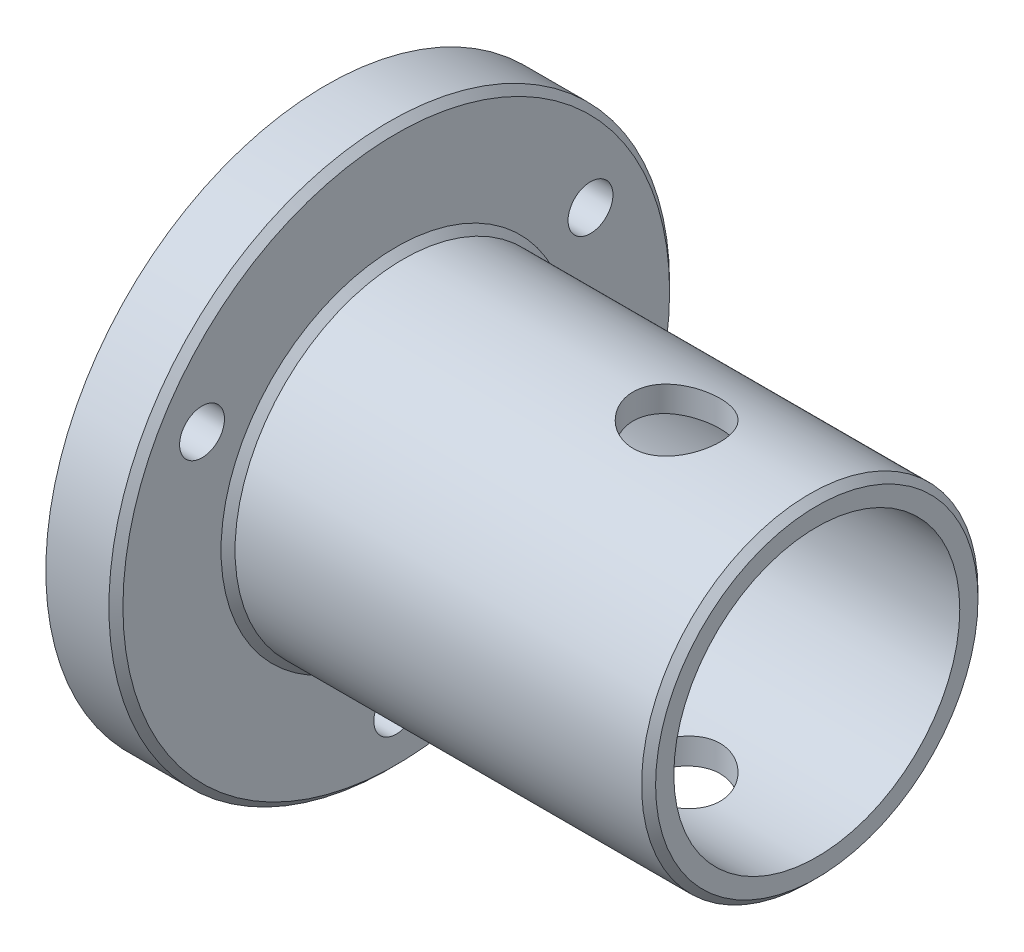
ISO-10303-21;
HEADER;
FILE_DESCRIPTION(('STEP AP214'),'2;1');
FILE_NAME('part.step','',(''),(''),'','','');
FILE_SCHEMA(('AUTOMOTIVE_DESIGN { 1 0 10303 214 1 1 1 1 }'));
ENDSEC;
DATA;
#1=APPLICATION_CONTEXT('core data for automotive mechanical design processes');
#2=APPLICATION_PROTOCOL_DEFINITION('international standard','automotive_design',2000,#1);
#3=PRODUCT_CONTEXT('',#1,'mechanical');
#4=PRODUCT('Part','Part','',(#3));
#5=PRODUCT_RELATED_PRODUCT_CATEGORY('part','',(#4));
#6=PRODUCT_DEFINITION_FORMATION('','',#4);
#7=PRODUCT_DEFINITION_CONTEXT('part definition',#1,'design');
#8=PRODUCT_DEFINITION('design','',#6,#7);
#9=PRODUCT_DEFINITION_SHAPE('','',#8);
#10=(LENGTH_UNIT() NAMED_UNIT(*) SI_UNIT(.MILLI.,.METRE.));
#11=(NAMED_UNIT(*) PLANE_ANGLE_UNIT() SI_UNIT($,.RADIAN.));
#12=(NAMED_UNIT(*) SI_UNIT($,.STERADIAN.) SOLID_ANGLE_UNIT());
#13=UNCERTAINTY_MEASURE_WITH_UNIT(LENGTH_MEASURE(1.E-05),#10,'distance_accuracy_value','');
#14=(GEOMETRIC_REPRESENTATION_CONTEXT(3) GLOBAL_UNCERTAINTY_ASSIGNED_CONTEXT((#13)) GLOBAL_UNIT_ASSIGNED_CONTEXT((#10,
#11,#12)) REPRESENTATION_CONTEXT('',''));
#15=CARTESIAN_POINT('',(0.,0.,0.));
#16=DIRECTION('',(0.,0.,1.));
#17=DIRECTION('',(1.,0.,0.));
#18=AXIS2_PLACEMENT_3D('',#15,#16,#17);
#19=CARTESIAN_POINT('',(35.,0.,0.));
#20=DIRECTION('',(-1.,0.,0.));
#21=DIRECTION('',(0.,0.,1.));
#22=AXIS2_PLACEMENT_3D('',#19,#20,#21);
#23=CYLINDRICAL_SURFACE('',#22,12.);
#24=CARTESIAN_POINT('',(5.50000000000001,0.,0.));
#25=DIRECTION('',(1.,0.,0.));
#26=DIRECTION('',(0.,0.,-1.));
#27=AXIS2_PLACEMENT_3D('',#24,#25,#26);
#28=CIRCLE('',#27,12.);
#29=CARTESIAN_POINT('',(5.50000000000001,0.,-12.));
#30=VERTEX_POINT('',#29);
#31=EDGE_CURVE('E48',#30,#30,#28,.T.);
#32=ORIENTED_EDGE('',*,*,#31,.T.);
#33=EDGE_LOOP('',(#32));
#34=FACE_BOUND('',#33,.T.);
#35=CARTESIAN_POINT('',(34.5,0.,0.));
#36=DIRECTION('',(1.,0.,0.));
#37=DIRECTION('',(0.,0.,-1.));
#38=AXIS2_PLACEMENT_3D('',#35,#36,#37);
#39=CIRCLE('',#38,12.);
#40=CARTESIAN_POINT('',(34.5,0.,-12.));
#41=VERTEX_POINT('',#40);
#42=EDGE_CURVE('E64',#41,#41,#39,.F.);
#43=ORIENTED_EDGE('',*,*,#42,.T.);
#44=EDGE_LOOP('',(#43));
#45=FACE_BOUND('',#44,.T.);
#46=CARTESIAN_POINT('',(25.,-11.5926700979541,-3.1));
#47=CARTESIAN_POINT('',(25.1709812687273,-11.5926732321222,-3.0999954912357));
#48=CARTESIAN_POINT('',(25.3420113313602,-11.5964941540659,-3.08580603872909));
#49=CARTESIAN_POINT('',(25.6791462756398,-11.611322692769,-3.02952201236185));
#50=CARTESIAN_POINT('',(25.8452484356607,-11.6223342063142,-2.9874123075328));
#51=CARTESIAN_POINT('',(26.1676021078596,-11.6502154462981,-2.8767528281645));
#52=CARTESIAN_POINT('',(26.323866564604,-11.6670772760698,-2.80823868019879));
#53=CARTESIAN_POINT('',(26.6227038965771,-11.7047492995837,-2.64682525331377));
#54=CARTESIAN_POINT('',(26.7652759501391,-11.7255597300546,-2.55392451222788));
#55=CARTESIAN_POINT('',(27.0360295916321,-11.7693315191616,-2.34404333029207));
#56=CARTESIAN_POINT('',(27.163842102149,-11.7923291195899,-2.22659423003465));
#57=CARTESIAN_POINT('',(27.3981915312794,-11.8375703908243,-1.97195898842077));
#58=CARTESIAN_POINT('',(27.5047263560674,-11.8598139872542,-1.83477090693754));
#59=CARTESIAN_POINT('',(27.695020595396,-11.9014436748245,-1.54200834198931));
#60=CARTESIAN_POINT('',(27.7784152918266,-11.9207820184585,-1.38618941543748));
#61=CARTESIAN_POINT('',(27.917687075037,-11.954007659976,-1.06216060658955));
#62=CARTESIAN_POINT('',(27.9735685063844,-11.9678958184176,-0.893952685441771));
#63=CARTESIAN_POINT('',(28.0550392473864,-11.9884000367007,-0.553770734206769));
#64=CARTESIAN_POINT('',(28.081255845454,-11.9951664669956,-0.381956155667461));
#65=CARTESIAN_POINT('',(28.1046239856346,-12.001189699885,-0.0362432207716312));
#66=CARTESIAN_POINT('',(28.1017801043448,-12.0004476849492,0.137654803164504));
#67=CARTESIAN_POINT('',(28.0675545353157,-11.9916487016588,0.478240037991099));
#68=CARTESIAN_POINT('',(28.0368502533953,-11.9837653766775,0.645000487656348));
#69=CARTESIAN_POINT('',(27.9488670322867,-11.9617730684823,0.970916767816803));
#70=CARTESIAN_POINT('',(27.8915866268404,-11.9476637417695,1.13007217819233));
#71=CARTESIAN_POINT('',(27.7515433557971,-11.9145431124111,1.43801789833881));
#72=CARTESIAN_POINT('',(27.6685438516611,-11.8954865666526,1.58669552694301));
#73=CARTESIAN_POINT('',(27.4795989672981,-11.8545318437837,1.86824666067749));
#74=CARTESIAN_POINT('',(27.3736493558522,-11.8326331429754,2.00111724451916));
#75=CARTESIAN_POINT('',(27.1381976920348,-11.7876283841855,2.25132438640943));
#76=CARTESIAN_POINT('',(27.0081042125355,-11.7645057211298,2.3681020323851));
#77=CARTESIAN_POINT('',(26.7299394465306,-11.7202333748904,2.57831380162861));
#78=CARTESIAN_POINT('',(26.5818671990644,-11.6990837972746,2.67174667630737));
#79=CARTESIAN_POINT('',(26.270795044652,-11.6610891819864,2.8330075364046));
#80=CARTESIAN_POINT('',(26.1077178096527,-11.6442683584863,2.90069245894728));
#81=CARTESIAN_POINT('',(25.7719576007214,-11.6171413090202,3.00750695874671));
#82=CARTESIAN_POINT('',(25.599276851601,-11.6068335809725,3.04664312037952));
#83=CARTESIAN_POINT('',(25.254416284425,-11.5942174237512,3.09430407740065));
#84=CARTESIAN_POINT('',(25.0823589764788,-11.5916921633405,3.10365887749602));
#85=CARTESIAN_POINT('',(24.7391401147316,-11.5943351499617,3.09377102744816));
#86=CARTESIAN_POINT('',(24.5679784738847,-11.5995026348923,3.07453121010369));
#87=CARTESIAN_POINT('',(24.2345484619628,-11.6167402601914,3.00873001478412));
#88=CARTESIAN_POINT('',(24.0721761697032,-11.6286862698099,2.96265957932974));
#89=CARTESIAN_POINT('',(23.7574610922742,-11.6580153953549,2.84505301580562));
#90=CARTESIAN_POINT('',(23.6051195589164,-11.6753991883511,2.77351371640119));
#91=CARTESIAN_POINT('',(23.3112953954056,-11.7140960291964,2.60528870310117));
#92=CARTESIAN_POINT('',(23.1701043789401,-11.735483254687,2.50811110154685));
#93=CARTESIAN_POINT('',(22.9057284588905,-11.7795988823168,2.2919839065464));
#94=CARTESIAN_POINT('',(22.782546730782,-11.8023275199903,2.1730304818004));
#95=CARTESIAN_POINT('',(22.5542829216208,-11.8473056159507,1.91290429530348));
#96=CARTESIAN_POINT('',(22.4497773110176,-11.86952570636,1.77121961861856));
#97=CARTESIAN_POINT('',(22.2660380700746,-11.9103524913061,1.47183340500616));
#98=CARTESIAN_POINT('',(22.1868031031189,-11.9289593769324,1.31413271578014));
#99=CARTESIAN_POINT('',(22.0565633389923,-11.9603442961819,0.988294681062561));
#100=CARTESIAN_POINT('',(22.0053511266874,-11.9731650294859,0.820244550200718));
#101=CARTESIAN_POINT('',(21.9319975894284,-11.991720545072,0.477545654715656));
#102=CARTESIAN_POINT('',(21.9098502465951,-11.9974567941815,0.302898263761298));
#103=CARTESIAN_POINT('',(21.895612710381,-12.0011325126361,-0.0426369024851989));
#104=CARTESIAN_POINT('',(21.9026743542239,-11.9992920014047,-0.213487900899179));
#105=CARTESIAN_POINT('',(21.9446985165505,-11.9885136629736,-0.551482300379906));
#106=CARTESIAN_POINT('',(21.9796601002656,-11.9795760735567,-0.718625825470205));
#107=CARTESIAN_POINT('',(22.0760243598104,-11.9556466521864,-1.04350746562916));
#108=CARTESIAN_POINT('',(22.1372644025869,-11.9406920931933,-1.20129674565794));
#109=CARTESIAN_POINT('',(22.284301037089,-11.9062979087882,-1.50445044483574));
#110=CARTESIAN_POINT('',(22.3701009020991,-11.8868576856027,-1.64981320444676));
#111=CARTESIAN_POINT('',(22.5663569175467,-11.8449659855827,-1.92797363703745));
#112=CARTESIAN_POINT('',(22.6773821284217,-11.8224507499527,-2.06036019542507));
#113=CARTESIAN_POINT('',(22.9198449996647,-11.7772189294356,-2.30491082042101));
#114=CARTESIAN_POINT('',(23.051287920397,-11.7545022940866,-2.41706965947591));
#115=CARTESIAN_POINT('',(23.3340626625102,-11.7109123351238,-2.62022343696176));
#116=CARTESIAN_POINT('',(23.485743729042,-11.6900857287345,-2.71074311737418));
#117=CARTESIAN_POINT('',(23.8026894353038,-11.653277237802,-2.86486495240525));
#118=CARTESIAN_POINT('',(23.9679445832601,-11.6372920039437,-2.92848572810478));
#119=CARTESIAN_POINT('',(24.2772970390116,-11.614338100382,-3.01809185517792));
#120=CARTESIAN_POINT('',(24.4199805799664,-11.6062759780297,-3.04873795147442));
#121=CARTESIAN_POINT('',(24.7084311240879,-11.5954409014947,-3.0896929427546));
#122=CARTESIAN_POINT('',(24.854197821516,-11.5926674253308,-3.10000384479342));
#123=CARTESIAN_POINT('',(25.,-11.5926700979541,-3.1));
#124=B_SPLINE_CURVE_WITH_KNOTS('',3,(#46,#47,#48,#49,#50,#51,#52,#53,#54,#55,#56,#57,#58,#59,
#60,#61,#62,#63,#64,#65,#66,#67,#68,#69,#70,#71,#72,#73,#74,#75,#76,#77,#78,#79,#80,#81,#82,#83,
#84,#85,#86,#87,#88,#89,#90,#91,#92,#93,#94,#95,#96,#97,#98,#99,#100,#101,#102,#103,#104,#105,
#106,#107,#108,#109,#110,#111,#112,#113,#114,#115,#116,#117,#118,#119,#120,#121,#122,#123),
.UNSPECIFIED.,.T.,.F.,(4,2,2,2,2,2,2,2,2,2,2,2,2,2,2,2,2,2,2,2,2,2,2,2,2,2,2,2,2,2,2,2,2,2,2,2,
2,2,4),(0.,0.512408032707482,1.02509398460181,1.53709059588618,2.0491179123776,2.57199825255387,
3.09493002132231,3.62568797741565,4.15636209562048,4.675591723518,5.19473958166113,
5.70159336892139,6.20847512364484,6.72016653527227,7.2319523658002,7.75850684065091,
8.28508947210651,8.81455663449601,9.34390164398051,9.85835850186142,10.3727643971578,
10.8780410008308,11.3833805426074,11.899226428746,12.4151631616504,12.9449880733492,
13.474784956878,14.000605506698,14.5263171682236,15.0368721362036,15.5474099991034,
16.0548327930151,16.5623232467484,17.0826576071283,17.6031262480937,18.1341484872393,
18.6648025157487,19.1017953096802,19.5387449708773),.UNSPECIFIED.);
#125=CARTESIAN_POINT('',(25.,-11.5926700979541,-3.1));
#126=VERTEX_POINT('',#125);
#127=EDGE_CURVE('E74',#126,#126,#124,.T.);
#128=ORIENTED_EDGE('',*,*,#127,.F.);
#129=EDGE_LOOP('',(#128));
#130=FACE_BOUND('',#129,.T.);
#131=CARTESIAN_POINT('',(25.,11.5926700979541,-3.1));
#132=CARTESIAN_POINT('',(24.8290187312727,11.5926732321222,-3.0999954912357));
#133=CARTESIAN_POINT('',(24.6579886686398,11.5964941540659,-3.08580603872909));
#134=CARTESIAN_POINT('',(24.3208537243602,11.611322692769,-3.02952201236185));
#135=CARTESIAN_POINT('',(24.1547515643393,11.6223342063142,-2.9874123075328));
#136=CARTESIAN_POINT('',(23.8323978921404,11.6502154462981,-2.8767528281645));
#137=CARTESIAN_POINT('',(23.676133435396,11.6670772760698,-2.80823868019879));
#138=CARTESIAN_POINT('',(23.3772961034229,11.7047492995837,-2.64682525331377));
#139=CARTESIAN_POINT('',(23.234724049861,11.7255597300546,-2.55392451222788));
#140=CARTESIAN_POINT('',(22.9639704083679,11.7693315191616,-2.34404333029207));
#141=CARTESIAN_POINT('',(22.836157897851,11.7923291195899,-2.22659423003465));
#142=CARTESIAN_POINT('',(22.6018084687206,11.8375703908244,-1.97195898842076));
#143=CARTESIAN_POINT('',(22.4952736439326,11.8598139872542,-1.83477090693754));
#144=CARTESIAN_POINT('',(22.304979404604,11.9014436748245,-1.54200834198931));
#145=CARTESIAN_POINT('',(22.2215847081734,11.9207820184585,-1.38618941543748));
#146=CARTESIAN_POINT('',(22.082312924963,11.954007659976,-1.06216060658955));
#147=CARTESIAN_POINT('',(22.0264314936156,11.9678958184176,-0.893952685441771));
#148=CARTESIAN_POINT('',(21.9449607526136,11.9884000367007,-0.553770734206769));
#149=CARTESIAN_POINT('',(21.918744154546,11.9951664669956,-0.381956155667461));
#150=CARTESIAN_POINT('',(21.8953760143654,12.001189699885,-0.0362432207716312));
#151=CARTESIAN_POINT('',(21.8982198956552,12.0004476849492,0.137654803164504));
#152=CARTESIAN_POINT('',(21.9324454646843,11.9916487016588,0.478240037991099));
#153=CARTESIAN_POINT('',(21.9631497466047,11.9837653766775,0.645000487656348));
#154=CARTESIAN_POINT('',(22.0511329677133,11.9617730684823,0.970916767816803));
#155=CARTESIAN_POINT('',(22.1084133731596,11.9476637417695,1.13007217819233));
#156=CARTESIAN_POINT('',(22.2484566442029,11.9145431124111,1.43801789833881));
#157=CARTESIAN_POINT('',(22.3314561483389,11.8954865666526,1.58669552694301));
#158=CARTESIAN_POINT('',(22.5204010327019,11.8545318437837,1.86824666067749));
#159=CARTESIAN_POINT('',(22.6263506441478,11.8326331429754,2.00111724451916));
#160=CARTESIAN_POINT('',(22.8618023079652,11.7876283841855,2.25132438640943));
#161=CARTESIAN_POINT('',(22.9918957874645,11.7645057211298,2.3681020323851));
#162=CARTESIAN_POINT('',(23.2700605534694,11.7202333748904,2.57831380162861));
#163=CARTESIAN_POINT('',(23.4181328009356,11.6990837972746,2.67174667630737));
#164=CARTESIAN_POINT('',(23.729204955348,11.6610891819864,2.8330075364046));
#165=CARTESIAN_POINT('',(23.8922821903473,11.6442683584863,2.90069245894728));
#166=CARTESIAN_POINT('',(24.2280423992787,11.6171413090202,3.00750695874672));
#167=CARTESIAN_POINT('',(24.400723148399,11.6068335809725,3.04664312037952));
#168=CARTESIAN_POINT('',(24.745583715575,11.5942174237512,3.09430407740065));
#169=CARTESIAN_POINT('',(24.9176410235212,11.5916921633405,3.10365887749602));
#170=CARTESIAN_POINT('',(25.2608598852684,11.5943351499617,3.09377102744816));
#171=CARTESIAN_POINT('',(25.4320215261153,11.5995026348923,3.07453121010369));
#172=CARTESIAN_POINT('',(25.7654515380372,11.6167402601914,3.00873001478412));
#173=CARTESIAN_POINT('',(25.9278238302968,11.6286862698099,2.96265957932974));
#174=CARTESIAN_POINT('',(26.2425389077258,11.6580153953549,2.84505301580562));
#175=CARTESIAN_POINT('',(26.3948804410836,11.6753991883511,2.77351371640119));
#176=CARTESIAN_POINT('',(26.6887046045944,11.7140960291964,2.60528870310117));
#177=CARTESIAN_POINT('',(26.8298956210599,11.735483254687,2.50811110154685));
#178=CARTESIAN_POINT('',(27.0942715411095,11.7795988823168,2.2919839065464));
#179=CARTESIAN_POINT('',(27.217453269218,11.8023275199903,2.1730304818004));
#180=CARTESIAN_POINT('',(27.4457170783792,11.8473056159507,1.91290429530348));
#181=CARTESIAN_POINT('',(27.5502226889824,11.86952570636,1.77121961861856));
#182=CARTESIAN_POINT('',(27.7339619299254,11.9103524913061,1.47183340500616));
#183=CARTESIAN_POINT('',(27.8131968968811,11.9289593769324,1.31413271578014));
#184=CARTESIAN_POINT('',(27.9434366610077,11.9603442961819,0.98829468106256));
#185=CARTESIAN_POINT('',(27.9946488733126,11.9731650294859,0.820244550200718));
#186=CARTESIAN_POINT('',(28.0680024105716,11.991720545072,0.477545654715656));
#187=CARTESIAN_POINT('',(28.0901497534049,11.9974567941815,0.302898263761298));
#188=CARTESIAN_POINT('',(28.104387289619,12.0011325126361,-0.0426369024851988));
#189=CARTESIAN_POINT('',(28.0973256457761,11.9992920014047,-0.213487900899178));
#190=CARTESIAN_POINT('',(28.0553014834495,11.9885136629736,-0.551482300379906));
#191=CARTESIAN_POINT('',(28.0203398997344,11.9795760735567,-0.718625825470205));
#192=CARTESIAN_POINT('',(27.9239756401896,11.9556466521864,-1.04350746562916));
#193=CARTESIAN_POINT('',(27.8627355974131,11.9406920931933,-1.20129674565794));
#194=CARTESIAN_POINT('',(27.715698962911,11.9062979087882,-1.50445044483574));
#195=CARTESIAN_POINT('',(27.6298990979009,11.8868576856027,-1.64981320444676));
#196=CARTESIAN_POINT('',(27.4336430824533,11.8449659855827,-1.92797363703745));
#197=CARTESIAN_POINT('',(27.3226178715783,11.8224507499527,-2.06036019542507));
#198=CARTESIAN_POINT('',(27.0801550003353,11.7772189294356,-2.30491082042101));
#199=CARTESIAN_POINT('',(26.948712079603,11.7545022940866,-2.41706965947591));
#200=CARTESIAN_POINT('',(26.6659373374898,11.7109123351238,-2.62022343696176));
#201=CARTESIAN_POINT('',(26.514256270958,11.6900857287345,-2.71074311737418));
#202=CARTESIAN_POINT('',(26.1973105646962,11.653277237802,-2.86486495240525));
#203=CARTESIAN_POINT('',(26.0320554167399,11.6372920039437,-2.92848572810478));
#204=CARTESIAN_POINT('',(25.7227029609884,11.614338100382,-3.01809185517792));
#205=CARTESIAN_POINT('',(25.5800194200336,11.6062759780297,-3.04873795147442));
#206=CARTESIAN_POINT('',(25.2915688759121,11.5954409014947,-3.0896929427546));
#207=CARTESIAN_POINT('',(25.145802178484,11.5926674253308,-3.10000384479342));
#208=CARTESIAN_POINT('',(25.,11.5926700979541,-3.1));
#209=B_SPLINE_CURVE_WITH_KNOTS('',3,(#131,#132,#133,#134,#135,#136,#137,#138,#139,#140,#141,
#142,#143,#144,#145,#146,#147,#148,#149,#150,#151,#152,#153,#154,#155,#156,#157,#158,#159,#160,
#161,#162,#163,#164,#165,#166,#167,#168,#169,#170,#171,#172,#173,#174,#175,#176,#177,#178,#179,
#180,#181,#182,#183,#184,#185,#186,#187,#188,#189,#190,#191,#192,#193,#194,#195,#196,#197,#198,
#199,#200,#201,#202,#203,#204,#205,#206,#207,#208),.UNSPECIFIED.,.T.,.F.,(4,2,2,2,2,2,2,2,2,2,2,
2,2,2,2,2,2,2,2,2,2,2,2,2,2,2,2,2,2,2,2,2,2,2,2,2,2,2,4),(0.,0.512408032707482,1.02509398460181,
1.53709059588618,2.0491179123776,2.57199825255387,3.09493002132231,3.62568797741565,
4.15636209562048,4.675591723518,5.19473958166113,5.70159336892139,6.20847512364484,
6.72016653527227,7.2319523658002,7.75850684065091,8.28508947210651,8.81455663449601,
9.34390164398051,9.85835850186142,10.3727643971578,10.8780410008308,11.3833805426074,
11.899226428746,12.4151631616504,12.9449880733492,13.474784956878,14.000605506698,
14.5263171682236,15.0368721362036,15.5474099991034,16.0548327930151,16.5623232467484,
17.0826576071283,17.6031262480937,18.1341484872393,18.6648025157487,19.1017953096802,
19.5387449708773),.UNSPECIFIED.);
#210=CARTESIAN_POINT('',(25.,11.5926700979541,-3.1));
#211=VERTEX_POINT('',#210);
#212=EDGE_CURVE('E106',#211,#211,#209,.T.);
#213=ORIENTED_EDGE('',*,*,#212,.F.);
#214=EDGE_LOOP('',(#213));
#215=FACE_BOUND('',#214,.T.);
#216=ADVANCED_FACE('F39',(#34,#45,#130,#215),#23,.T.);
#217=CARTESIAN_POINT('',(5.,0.,0.));
#218=DIRECTION('',(1.,0.,0.));
#219=DIRECTION('',(0.,0.,-1.));
#220=AXIS2_PLACEMENT_3D('',#217,#218,#219);
#221=CYLINDRICAL_SURFACE('',#220,10.2);
#222=CARTESIAN_POINT('',(5.,0.,0.));
#223=DIRECTION('',(1.,0.,0.));
#224=DIRECTION('',(0.,0.,-1.));
#225=AXIS2_PLACEMENT_3D('',#222,#223,#224);
#226=CIRCLE('',#225,10.2);
#227=CARTESIAN_POINT('',(5.,0.,-10.2));
#228=VERTEX_POINT('',#227);
#229=EDGE_CURVE('E156',#228,#228,#226,.T.);
#230=ORIENTED_EDGE('',*,*,#229,.F.);
#231=EDGE_LOOP('',(#230));
#232=FACE_BOUND('',#231,.T.);
#233=CARTESIAN_POINT('',(35.,0.,0.));
#234=DIRECTION('',(1.,0.,0.));
#235=DIRECTION('',(0.,0.,-1.));
#236=AXIS2_PLACEMENT_3D('',#233,#234,#235);
#237=CIRCLE('',#236,10.2);
#238=CARTESIAN_POINT('',(35.,0.,-10.2));
#239=VERTEX_POINT('',#238);
#240=EDGE_CURVE('E163',#239,#239,#237,.T.);
#241=ORIENTED_EDGE('',*,*,#240,.T.);
#242=EDGE_LOOP('',(#241));
#243=FACE_BOUND('',#242,.T.);
#244=CARTESIAN_POINT('',(25.,-9.71750996912275,-3.1));
#245=CARTESIAN_POINT('',(24.8302450215042,-9.71751152044069,-3.09999817405107));
#246=CARTESIAN_POINT('',(24.6604719771617,-9.72200681201951,-3.08600901394495));
#247=CARTESIAN_POINT('',(24.3258968655872,-9.73942808103335,-3.03057106714479));
#248=CARTESIAN_POINT('',(24.161096376696,-9.75235670644731,-2.98911365564171));
#249=CARTESIAN_POINT('',(23.8413591630495,-9.78504803212674,-2.88028292198343));
#250=CARTESIAN_POINT('',(23.6864062263503,-9.80479913636959,-2.81295355215432));
#251=CARTESIAN_POINT('',(23.389955714033,-9.84889414240463,-2.65443526710116));
#252=CARTESIAN_POINT('',(23.2484602716798,-9.87323877053737,-2.56324257766043));
#253=CARTESIAN_POINT('',(22.978344989818,-9.92466471031361,-2.35641449228445));
#254=CARTESIAN_POINT('',(22.8502268031283,-9.95180548758248,-2.24013857784791));
#255=CARTESIAN_POINT('',(22.6149750509031,-10.005258279883,-1.98781669350988));
#256=CARTESIAN_POINT('',(22.507844253431,-10.0315701852097,-1.85176811987424));
#257=CARTESIAN_POINT('',(22.3154190333366,-10.0810775315666,-1.56018293657677));
#258=CARTESIAN_POINT('',(22.2306376916155,-10.1041947568644,-1.40429328666226));
#259=CARTESIAN_POINT('',(22.0886896508701,-10.1440160742436,-1.07964676222009));
#260=CARTESIAN_POINT('',(22.0315168312215,-10.1607215875898,-0.910892749249633));
#261=CARTESIAN_POINT('',(21.9480734911396,-10.1854164163053,-0.570557381789036));
#262=CARTESIAN_POINT('',(21.9209463428416,-10.1936468513655,-0.39920386796128));
#263=CARTESIAN_POINT('',(21.8956540161598,-10.2013140734623,-0.05419318290849));
#264=CARTESIAN_POINT('',(21.8974825998725,-10.2007527544977,0.119463484096522));
#265=CARTESIAN_POINT('',(21.9294783884922,-10.1910693627075,0.458135320732019));
#266=CARTESIAN_POINT('',(21.9587176388452,-10.1822276232319,0.623247442175158));
#267=CARTESIAN_POINT('',(22.0431868451824,-10.1573188275363,0.946099613824698));
#268=CARTESIAN_POINT('',(22.0984184632633,-10.1412513092627,1.10383919188041));
#269=CARTESIAN_POINT('',(22.2339229180099,-10.1033122578068,1.40965435486965));
#270=CARTESIAN_POINT('',(22.3144844142241,-10.0813742771303,1.55759345374656));
#271=CARTESIAN_POINT('',(22.4981324522778,-10.0340164420241,1.83814744235965));
#272=CARTESIAN_POINT('',(22.6012244491734,-10.0085957449207,1.9707586090077));
#273=CARTESIAN_POINT('',(22.8318048177572,-9.95580268410267,2.22242892081083));
#274=CARTESIAN_POINT('',(22.9600963080449,-9.92839289329177,2.34074539451154));
#275=CARTESIAN_POINT('',(23.23496359088,-9.87558572669925,2.55439820171712));
#276=CARTESIAN_POINT('',(23.3815412989424,-9.85018856220037,2.64973212468498));
#277=CARTESIAN_POINT('',(23.690819755918,-9.8041002409542,2.81551563282123));
#278=CARTESIAN_POINT('',(23.8536679883314,-9.78345904441839,2.8857049894421));
#279=CARTESIAN_POINT('',(24.1896478503937,-9.74981034050356,2.99743933215379));
#280=CARTESIAN_POINT('',(24.3627759996615,-9.73680026556839,3.03899395346983));
#281=CARTESIAN_POINT('',(24.7073183007616,-9.7204523589455,3.0908772547888));
#282=CARTESIAN_POINT('',(24.8785455671834,-9.71676424006692,3.10233745629306));
#283=CARTESIAN_POINT('',(25.2204835509012,-9.71850799272476,3.09687162522216));
#284=CARTESIAN_POINT('',(25.3911943392275,-9.72393854720213,3.07994969203184));
#285=CARTESIAN_POINT('',(25.7224871317896,-9.74296332767579,3.01920875619412));
#286=CARTESIAN_POINT('',(25.8832180488902,-9.75633422980108,2.9761248439431));
#287=CARTESIAN_POINT('',(26.1951566175759,-9.78950014170735,2.86513861093793));
#288=CARTESIAN_POINT('',(26.3463627682508,-9.80929616094788,2.79723239010284));
#289=CARTESIAN_POINT('',(26.639545020713,-9.85375620540459,2.63640131889928));
#290=CARTESIAN_POINT('',(26.7811544061834,-9.87853881529002,2.54284158263211));
#291=CARTESIAN_POINT('',(27.0470762888478,-9.92992781491066,2.33410928364215));
#292=CARTESIAN_POINT('',(27.1713845230862,-9.95653465172834,2.21893141063123));
#293=CARTESIAN_POINT('',(27.4041569772682,-10.0098260484167,1.96490204351708));
#294=CARTESIAN_POINT('',(27.5118173002569,-10.0364734121133,1.82530424513182));
#295=CARTESIAN_POINT('',(27.7022076049596,-10.0858041855733,1.52938564942507));
#296=CARTESIAN_POINT('',(27.7849387988074,-10.108487788045,1.37306566569059));
#297=CARTESIAN_POINT('',(27.9223244655421,-10.147199166401,1.04915396951939));
#298=CARTESIAN_POINT('',(27.9771870565103,-10.1632761018927,0.881656703786007));
#299=CARTESIAN_POINT('',(28.05779818094,-10.1871795891735,0.539242024508868));
#300=CARTESIAN_POINT('',(28.083555284632,-10.195008569561,0.364326810958115));
#301=CARTESIAN_POINT('',(28.1045586590578,-10.2013821230789,0.0194614478171838));
#302=CARTESIAN_POINT('',(28.1009692789239,-10.2002810199824,-0.150412109609827));
#303=CARTESIAN_POINT('',(28.0661750168558,-10.1897574489741,-0.487029052736546));
#304=CARTESIAN_POINT('',(28.0349717720991,-10.1803354743921,-0.653772623409167));
#305=CARTESIAN_POINT('',(27.9465627581109,-10.1543333132044,-0.977560580536301));
#306=CARTESIAN_POINT('',(27.8896540826081,-10.1378350190092,-1.13469311646604));
#307=CARTESIAN_POINT('',(27.7517161025282,-10.0993845917701,-1.43725992323385));
#308=CARTESIAN_POINT('',(27.670682776863,-10.0774315496317,-1.58269223874625));
#309=CARTESIAN_POINT('',(27.4837345655533,-10.0294829537495,-1.86288624651997));
#310=CARTESIAN_POINT('',(27.3770945300677,-10.0033789276274,-1.99714538316468));
#311=CARTESIAN_POINT('',(27.1432575142778,-9.95040724486369,-2.24625153460547));
#312=CARTESIAN_POINT('',(27.0160545426973,-9.92353936755032,-2.36109287176285));
#313=CARTESIAN_POINT('',(26.7399985787473,-9.87110435373929,-2.57166419856939));
#314=CARTESIAN_POINT('',(26.5905990918477,-9.84560284157931,-2.6666959638801));
#315=CARTESIAN_POINT('',(26.2771983529708,-9.79986132175625,-2.83018841200397));
#316=CARTESIAN_POINT('',(26.1132038217015,-9.77961890904759,-2.89866124760287));
#317=CARTESIAN_POINT('',(25.7923076301982,-9.74858345429049,-3.00128316633864));
#318=CARTESIAN_POINT('',(25.6363592817447,-9.73704318175158,-3.03819792227743));
#319=CARTESIAN_POINT('',(25.3202787134467,-9.72150651435692,-3.08755458260381));
#320=CARTESIAN_POINT('',(25.1601473961124,-9.71750850560438,-3.10000172260613));
#321=CARTESIAN_POINT('',(25.,-9.71750996912275,-3.1));
#322=B_SPLINE_CURVE_WITH_KNOTS('',3,(#244,#245,#246,#247,#248,#249,#250,#251,#252,#253,#254,
#255,#256,#257,#258,#259,#260,#261,#262,#263,#264,#265,#266,#267,#268,#269,#270,#271,#272,#273,
#274,#275,#276,#277,#278,#279,#280,#281,#282,#283,#284,#285,#286,#287,#288,#289,#290,#291,#292,
#293,#294,#295,#296,#297,#298,#299,#300,#301,#302,#303,#304,#305,#306,#307,#308,#309,#310,#311,
#312,#313,#314,#315,#316,#317,#318,#319,#320,#321),.UNSPECIFIED.,.T.,.F.,(4,2,2,2,2,2,2,2,2,2,2,
2,2,2,2,2,2,2,2,2,2,2,2,2,2,2,2,2,2,2,2,2,2,2,2,2,2,2,4),(0.,0.508673923489766,1.01750764222181,
1.52548072835019,2.03353420398484,2.55654379281369,3.0796223159146,3.61382976824119,
4.14791873592496,4.66635360874123,5.18467679718739,5.68606308682018,6.18748144224144,
6.69483477824863,7.20231109035253,7.72984243161905,8.25742907924015,8.79032805081103,
9.32304762096161,9.83543005156785,10.3477384823882,10.846278448659,11.3448967792182,
11.8571856041719,12.3696004330476,12.9019373597178,13.4342483982882,13.9625235274308,
14.49064306322,14.9979137697689,15.5051544031428,16.0066768759045,16.5082829890964,
17.0262447880098,17.5443577746761,18.0784415355625,18.6122806222767,19.0922679675325,
19.5721525932384),.UNSPECIFIED.);
#323=CARTESIAN_POINT('',(25.,-9.71750996912275,-3.1));
#324=VERTEX_POINT('',#323);
#325=EDGE_CURVE('E75',#324,#324,#322,.T.);
#326=ORIENTED_EDGE('',*,*,#325,.F.);
#327=EDGE_LOOP('',(#326));
#328=FACE_BOUND('',#327,.T.);
#329=CARTESIAN_POINT('',(25.,9.71750996912275,-3.1));
#330=CARTESIAN_POINT('',(25.1697549784958,9.71751152044069,-3.09999817405107));
#331=CARTESIAN_POINT('',(25.3395280228383,9.72200681201951,-3.08600901394495));
#332=CARTESIAN_POINT('',(25.6741031344128,9.73942808103335,-3.03057106714479));
#333=CARTESIAN_POINT('',(25.838903623304,9.75235670644731,-2.98911365564171));
#334=CARTESIAN_POINT('',(26.1586408369505,9.78504803212674,-2.88028292198343));
#335=CARTESIAN_POINT('',(26.3135937736497,9.80479913636959,-2.81295355215432));
#336=CARTESIAN_POINT('',(26.610044285967,9.84889414240463,-2.65443526710116));
#337=CARTESIAN_POINT('',(26.7515397283202,9.87323877053737,-2.56324257766043));
#338=CARTESIAN_POINT('',(27.021655010182,9.92466471031361,-2.35641449228445));
#339=CARTESIAN_POINT('',(27.1497731968717,9.95180548758248,-2.24013857784791));
#340=CARTESIAN_POINT('',(27.3850249490969,10.005258279883,-1.98781669350988));
#341=CARTESIAN_POINT('',(27.492155746569,10.0315701852097,-1.85176811987424));
#342=CARTESIAN_POINT('',(27.6845809666634,10.0810775315666,-1.56018293657677));
#343=CARTESIAN_POINT('',(27.7693623083845,10.1041947568644,-1.40429328666226));
#344=CARTESIAN_POINT('',(27.9113103491299,10.1440160742436,-1.07964676222009));
#345=CARTESIAN_POINT('',(27.9684831687785,10.1607215875898,-0.910892749249632));
#346=CARTESIAN_POINT('',(28.0519265088604,10.1854164163053,-0.570557381789036));
#347=CARTESIAN_POINT('',(28.0790536571584,10.1936468513655,-0.39920386796128));
#348=CARTESIAN_POINT('',(28.1043459838402,10.2013140734623,-0.0541931829084899));
#349=CARTESIAN_POINT('',(28.1025174001275,10.2007527544977,0.119463484096522));
#350=CARTESIAN_POINT('',(28.0705216115078,10.1910693627075,0.458135320732019));
#351=CARTESIAN_POINT('',(28.0412823611548,10.1822276232319,0.623247442175158));
#352=CARTESIAN_POINT('',(27.9568131548176,10.1573188275363,0.946099613824697));
#353=CARTESIAN_POINT('',(27.9015815367367,10.1412513092627,1.10383919188041));
#354=CARTESIAN_POINT('',(27.7660770819901,10.1033122578068,1.40965435486965));
#355=CARTESIAN_POINT('',(27.6855155857759,10.0813742771303,1.55759345374656));
#356=CARTESIAN_POINT('',(27.5018675477222,10.0340164420241,1.83814744235965));
#357=CARTESIAN_POINT('',(27.3987755508266,10.0085957449207,1.9707586090077));
#358=CARTESIAN_POINT('',(27.1681951822428,9.95580268410267,2.22242892081083));
#359=CARTESIAN_POINT('',(27.0399036919551,9.92839289329177,2.34074539451154));
#360=CARTESIAN_POINT('',(26.7650364091201,9.87558572669925,2.55439820171711));
#361=CARTESIAN_POINT('',(26.6184587010576,9.85018856220037,2.64973212468498));
#362=CARTESIAN_POINT('',(26.309180244082,9.8041002409542,2.81551563282123));
#363=CARTESIAN_POINT('',(26.1463320116686,9.78345904441839,2.8857049894421));
#364=CARTESIAN_POINT('',(25.8103521496063,9.74981034050356,2.99743933215379));
#365=CARTESIAN_POINT('',(25.6372240003385,9.73680026556839,3.03899395346983));
#366=CARTESIAN_POINT('',(25.2926816992384,9.7204523589455,3.0908772547888));
#367=CARTESIAN_POINT('',(25.1214544328166,9.71676424006692,3.10233745629306));
#368=CARTESIAN_POINT('',(24.7795164490988,9.71850799272476,3.09687162522216));
#369=CARTESIAN_POINT('',(24.6088056607725,9.72393854720213,3.07994969203184));
#370=CARTESIAN_POINT('',(24.2775128682104,9.74296332767579,3.01920875619412));
#371=CARTESIAN_POINT('',(24.1167819511098,9.75633422980108,2.9761248439431));
#372=CARTESIAN_POINT('',(23.8048433824241,9.78950014170735,2.86513861093793));
#373=CARTESIAN_POINT('',(23.6536372317492,9.80929616094788,2.79723239010284));
#374=CARTESIAN_POINT('',(23.360454979287,9.85375620540459,2.63640131889928));
#375=CARTESIAN_POINT('',(23.2188455938166,9.87853881529002,2.54284158263211));
#376=CARTESIAN_POINT('',(22.9529237111522,9.92992781491066,2.33410928364215));
#377=CARTESIAN_POINT('',(22.8286154769138,9.95653465172834,2.21893141063123));
#378=CARTESIAN_POINT('',(22.5958430227318,10.0098260484167,1.96490204351708));
#379=CARTESIAN_POINT('',(22.4881826997431,10.0364734121133,1.82530424513182));
#380=CARTESIAN_POINT('',(22.2977923950404,10.0858041855733,1.52938564942507));
#381=CARTESIAN_POINT('',(22.2150612011926,10.108487788045,1.37306566569059));
#382=CARTESIAN_POINT('',(22.0776755344579,10.147199166401,1.04915396951939));
#383=CARTESIAN_POINT('',(22.0228129434897,10.1632761018927,0.881656703786007));
#384=CARTESIAN_POINT('',(21.94220181906,10.1871795891735,0.539242024508868));
#385=CARTESIAN_POINT('',(21.916444715368,10.195008569561,0.364326810958115));
#386=CARTESIAN_POINT('',(21.8954413409422,10.2013821230789,0.0194614478171838));
#387=CARTESIAN_POINT('',(21.8990307210761,10.2002810199824,-0.150412109609827));
#388=CARTESIAN_POINT('',(21.9338249831442,10.1897574489741,-0.487029052736546));
#389=CARTESIAN_POINT('',(21.9650282279009,10.1803354743921,-0.653772623409167));
#390=CARTESIAN_POINT('',(22.0534372418891,10.1543333132044,-0.9775605805363));
#391=CARTESIAN_POINT('',(22.1103459173919,10.1378350190092,-1.13469311646604));
#392=CARTESIAN_POINT('',(22.2482838974719,10.0993845917701,-1.43725992323385));
#393=CARTESIAN_POINT('',(22.329317223137,10.0774315496317,-1.58269223874625));
#394=CARTESIAN_POINT('',(22.5162654344467,10.0294829537495,-1.86288624651997));
#395=CARTESIAN_POINT('',(22.6229054699323,10.0033789276274,-1.99714538316468));
#396=CARTESIAN_POINT('',(22.8567424857222,9.95040724486369,-2.24625153460547));
#397=CARTESIAN_POINT('',(22.9839454573027,9.92353936755032,-2.36109287176285));
#398=CARTESIAN_POINT('',(23.2600014212527,9.87110435373929,-2.57166419856939));
#399=CARTESIAN_POINT('',(23.4094009081523,9.84560284157931,-2.6666959638801));
#400=CARTESIAN_POINT('',(23.7228016470292,9.79986132175625,-2.83018841200397));
#401=CARTESIAN_POINT('',(23.8867961782985,9.77961890904759,-2.89866124760287));
#402=CARTESIAN_POINT('',(24.2076923698018,9.74858345429049,-3.00128316633864));
#403=CARTESIAN_POINT('',(24.3636407182553,9.73704318175158,-3.03819792227743));
#404=CARTESIAN_POINT('',(24.6797212865533,9.72150651435692,-3.08755458260381));
#405=CARTESIAN_POINT('',(24.8398526038876,9.71750850560438,-3.10000172260613));
#406=CARTESIAN_POINT('',(25.,9.71750996912275,-3.1));
#407=B_SPLINE_CURVE_WITH_KNOTS('',3,(#329,#330,#331,#332,#333,#334,#335,#336,#337,#338,#339,
#340,#341,#342,#343,#344,#345,#346,#347,#348,#349,#350,#351,#352,#353,#354,#355,#356,#357,#358,
#359,#360,#361,#362,#363,#364,#365,#366,#367,#368,#369,#370,#371,#372,#373,#374,#375,#376,#377,
#378,#379,#380,#381,#382,#383,#384,#385,#386,#387,#388,#389,#390,#391,#392,#393,#394,#395,#396,
#397,#398,#399,#400,#401,#402,#403,#404,#405,#406),.UNSPECIFIED.,.T.,.F.,(4,2,2,2,2,2,2,2,2,2,2,
2,2,2,2,2,2,2,2,2,2,2,2,2,2,2,2,2,2,2,2,2,2,2,2,2,2,2,4),(0.,0.508673923489766,1.01750764222181,
1.52548072835019,2.03353420398484,2.55654379281369,3.0796223159146,3.61382976824119,
4.14791873592496,4.66635360874123,5.18467679718739,5.68606308682018,6.18748144224144,
6.69483477824862,7.20231109035253,7.72984243161904,8.25742907924014,8.79032805081103,
9.32304762096161,9.83543005156785,10.3477384823882,10.846278448659,11.3448967792182,
11.8571856041719,12.3696004330476,12.9019373597177,13.4342483982882,13.9625235274308,
14.49064306322,14.9979137697689,15.5051544031428,16.0066768759045,16.5082829890964,
17.0262447880098,17.5443577746761,18.0784415355625,18.6122806222767,19.0922679675325,
19.5721525932384),.UNSPECIFIED.);
#408=CARTESIAN_POINT('',(25.,9.71750996912275,-3.1));
#409=VERTEX_POINT('',#408);
#410=EDGE_CURVE('E65',#409,#409,#407,.T.);
#411=ORIENTED_EDGE('',*,*,#410,.F.);
#412=EDGE_LOOP('',(#411));
#413=FACE_BOUND('',#412,.T.);
#414=ADVANCED_FACE('F80',(#232,#243,#328,#413),#221,.F.);
#415=CARTESIAN_POINT('',(5.,0.,0.));
#416=DIRECTION('',(-1.,0.,0.));
#417=DIRECTION('',(0.,0.,1.));
#418=AXIS2_PLACEMENT_3D('',#415,#416,#417);
#419=CYLINDRICAL_SURFACE('',#418,20.);
#420=CARTESIAN_POINT('',(4.5,0.,0.));
#421=DIRECTION('',(1.,0.,0.));
#422=DIRECTION('',(0.,0.,-1.));
#423=AXIS2_PLACEMENT_3D('',#420,#421,#422);
#424=CIRCLE('',#423,20.);
#425=CARTESIAN_POINT('',(4.5,0.,-20.));
#426=VERTEX_POINT('',#425);
#427=EDGE_CURVE('E53',#426,#426,#424,.F.);
#428=ORIENTED_EDGE('',*,*,#427,.T.);
#429=EDGE_LOOP('',(#428));
#430=FACE_BOUND('',#429,.T.);
#431=CARTESIAN_POINT('',(0.,0.,0.));
#432=DIRECTION('',(1.,0.,0.));
#433=DIRECTION('',(0.,0.,-1.));
#434=AXIS2_PLACEMENT_3D('',#431,#432,#433);
#435=CIRCLE('',#434,20.);
#436=CARTESIAN_POINT('',(0.,0.,-20.));
#437=VERTEX_POINT('',#436);
#438=EDGE_CURVE('E152',#437,#437,#435,.T.);
#439=ORIENTED_EDGE('',*,*,#438,.T.);
#440=EDGE_LOOP('',(#439));
#441=FACE_BOUND('',#440,.T.);
#442=ADVANCED_FACE('F122',(#430,#441),#419,.T.);
#443=CARTESIAN_POINT('',(5.,0.,0.));
#444=DIRECTION('',(1.,0.,0.));
#445=DIRECTION('',(0.,0.,-1.));
#446=AXIS2_PLACEMENT_3D('',#443,#444,#445);
#447=PLANE('',#446);
#448=CARTESIAN_POINT('',(5.,8.,-13.856406460551));
#449=DIRECTION('',(1.,0.,0.));
#450=DIRECTION('',(0.,0.,-1.));
#451=AXIS2_PLACEMENT_3D('',#448,#449,#450);
#452=CIRCLE('',#451,1.6);
#453=CARTESIAN_POINT('',(5.,8.,-15.456406460551));
#454=VERTEX_POINT('',#453);
#455=EDGE_CURVE('E107',#454,#454,#452,.T.);
#456=ORIENTED_EDGE('',*,*,#455,.F.);
#457=EDGE_LOOP('',(#456));
#458=FACE_BOUND('',#457,.T.);
#459=CARTESIAN_POINT('',(5.,8.,13.856406460551));
#460=DIRECTION('',(1.,0.,0.));
#461=DIRECTION('',(0.,0.,-1.));
#462=AXIS2_PLACEMENT_3D('',#459,#460,#461);
#463=CIRCLE('',#462,1.6);
#464=CARTESIAN_POINT('',(5.,8.,12.256406460551));
#465=VERTEX_POINT('',#464);
#466=EDGE_CURVE('E189',#465,#465,#463,.T.);
#467=ORIENTED_EDGE('',*,*,#466,.F.);
#468=EDGE_LOOP('',(#467));
#469=FACE_BOUND('',#468,.T.);
#470=CARTESIAN_POINT('',(5.,-16.,0.));
#471=DIRECTION('',(1.,0.,0.));
#472=DIRECTION('',(0.,0.,-1.));
#473=AXIS2_PLACEMENT_3D('',#470,#471,#472);
#474=CIRCLE('',#473,1.59999999999999);
#475=CARTESIAN_POINT('',(5.,-16.,-1.59999999999999));
#476=VERTEX_POINT('',#475);
#477=EDGE_CURVE('E192',#476,#476,#474,.T.);
#478=ORIENTED_EDGE('',*,*,#477,.F.);
#479=EDGE_LOOP('',(#478));
#480=FACE_BOUND('',#479,.T.);
#481=CARTESIAN_POINT('',(5.,0.,0.));
#482=DIRECTION('',(1.,0.,0.));
#483=DIRECTION('',(0.,0.,-1.));
#484=AXIS2_PLACEMENT_3D('',#481,#482,#483);
#485=CIRCLE('',#484,12.5);
#486=CARTESIAN_POINT('',(5.,0.,-12.5));
#487=VERTEX_POINT('',#486);
#488=EDGE_CURVE('E10',#487,#487,#485,.F.);
#489=ORIENTED_EDGE('',*,*,#488,.T.);
#490=EDGE_LOOP('',(#489));
#491=FACE_BOUND('',#490,.T.);
#492=CARTESIAN_POINT('',(5.,0.,0.));
#493=DIRECTION('',(1.,0.,0.));
#494=DIRECTION('',(0.,0.,-1.));
#495=AXIS2_PLACEMENT_3D('',#492,#493,#494);
#496=CIRCLE('',#495,19.5);
#497=CARTESIAN_POINT('',(5.,0.,-19.5));
#498=VERTEX_POINT('',#497);
#499=EDGE_CURVE('E58',#498,#498,#496,.T.);
#500=ORIENTED_EDGE('',*,*,#499,.T.);
#501=EDGE_LOOP('',(#500));
#502=FACE_BOUND('',#501,.T.);
#503=ADVANCED_FACE('F117',(#458,#469,#480,#491,#502),#447,.T.);
#504=CARTESIAN_POINT('',(0.,0.,0.));
#505=DIRECTION('',(1.,0.,0.));
#506=DIRECTION('',(0.,0.,-1.));
#507=AXIS2_PLACEMENT_3D('',#504,#505,#506);
#508=PLANE('',#507);
#509=CARTESIAN_POINT('',(0.,8.,-13.856406460551));
#510=DIRECTION('',(-1.,0.,0.));
#511=DIRECTION('',(0.,0.,1.));
#512=AXIS2_PLACEMENT_3D('',#509,#510,#511);
#513=CIRCLE('',#512,1.6);
#514=CARTESIAN_POINT('',(0.,8.,-12.256406460551));
#515=VERTEX_POINT('',#514);
#516=EDGE_CURVE('E195',#515,#515,#513,.T.);
#517=ORIENTED_EDGE('',*,*,#516,.F.);
#518=EDGE_LOOP('',(#517));
#519=FACE_BOUND('',#518,.T.);
#520=CARTESIAN_POINT('',(0.,8.,13.856406460551));
#521=DIRECTION('',(-1.,0.,0.));
#522=DIRECTION('',(0.,0.,1.));
#523=AXIS2_PLACEMENT_3D('',#520,#521,#522);
#524=CIRCLE('',#523,1.6);
#525=CARTESIAN_POINT('',(0.,8.,15.456406460551));
#526=VERTEX_POINT('',#525);
#527=EDGE_CURVE('E199',#526,#526,#524,.T.);
#528=ORIENTED_EDGE('',*,*,#527,.F.);
#529=EDGE_LOOP('',(#528));
#530=FACE_BOUND('',#529,.T.);
#531=CARTESIAN_POINT('',(0.,-16.,0.));
#532=DIRECTION('',(-1.,0.,0.));
#533=DIRECTION('',(0.,0.,1.));
#534=AXIS2_PLACEMENT_3D('',#531,#532,#533);
#535=CIRCLE('',#534,1.59999999999999);
#536=CARTESIAN_POINT('',(0.,-16.,1.59999999999999));
#537=VERTEX_POINT('',#536);
#538=EDGE_CURVE('E203',#537,#537,#535,.T.);
#539=ORIENTED_EDGE('',*,*,#538,.F.);
#540=EDGE_LOOP('',(#539));
#541=FACE_BOUND('',#540,.T.);
#542=ORIENTED_EDGE('',*,*,#438,.F.);
#543=EDGE_LOOP('',(#542));
#544=FACE_BOUND('',#543,.T.);
#545=ADVANCED_FACE('F121',(#519,#530,#541,#544),#508,.F.);
#546=CARTESIAN_POINT('',(35.,0.,0.));
#547=DIRECTION('',(1.,0.,0.));
#548=DIRECTION('',(0.,0.,-1.));
#549=AXIS2_PLACEMENT_3D('',#546,#547,#548);
#550=PLANE('',#549);
#551=CARTESIAN_POINT('',(35.,0.,0.));
#552=DIRECTION('',(1.,0.,0.));
#553=DIRECTION('',(0.,0.,-1.));
#554=AXIS2_PLACEMENT_3D('',#551,#552,#553);
#555=CIRCLE('',#554,11.5);
#556=CARTESIAN_POINT('',(35.,0.,-11.5));
#557=VERTEX_POINT('',#556);
#558=EDGE_CURVE('E155',#557,#557,#555,.T.);
#559=ORIENTED_EDGE('',*,*,#558,.T.);
#560=EDGE_LOOP('',(#559));
#561=FACE_BOUND('',#560,.T.);
#562=ORIENTED_EDGE('',*,*,#240,.F.);
#563=EDGE_LOOP('',(#562));
#564=FACE_BOUND('',#563,.T.);
#565=ADVANCED_FACE('F116',(#561,#564),#550,.T.);
#566=CARTESIAN_POINT('',(5.,0.,0.));
#567=DIRECTION('',(1.,0.,0.));
#568=DIRECTION('',(0.,0.,-1.));
#569=AXIS2_PLACEMENT_3D('',#566,#567,#568);
#570=PLANE('',#569);
#571=ORIENTED_EDGE('',*,*,#229,.T.);
#572=EDGE_LOOP('',(#571));
#573=FACE_BOUND('',#572,.T.);
#574=ADVANCED_FACE('F93',(#573),#570,.T.);
#575=CARTESIAN_POINT('',(35.,0.,0.));
#576=DIRECTION('',(-1.,0.,0.));
#577=DIRECTION('',(0.,0.,1.));
#578=AXIS2_PLACEMENT_3D('',#575,#576,#577);
#579=CONICAL_SURFACE('',#578,11.5,0.78539816339744);
#580=ORIENTED_EDGE('',*,*,#42,.F.);
#581=EDGE_LOOP('',(#580));
#582=FACE_BOUND('',#581,.T.);
#583=ORIENTED_EDGE('',*,*,#558,.F.);
#584=EDGE_LOOP('',(#583));
#585=FACE_BOUND('',#584,.T.);
#586=ADVANCED_FACE('F131',(#582,#585),#579,.T.);
#587=CARTESIAN_POINT('',(25.,20.,0.));
#588=DIRECTION('',(0.,-1.,0.));
#589=DIRECTION('',(0.,0.,-1.));
#590=AXIS2_PLACEMENT_3D('',#587,#588,#589);
#591=CYLINDRICAL_SURFACE('',#590,3.1);
#592=ORIENTED_EDGE('',*,*,#325,.T.);
#593=EDGE_LOOP('',(#592));
#594=FACE_BOUND('',#593,.T.);
#595=ORIENTED_EDGE('',*,*,#127,.T.);
#596=EDGE_LOOP('',(#595));
#597=FACE_BOUND('',#596,.T.);
#598=ADVANCED_FACE('F89',(#594,#597),#591,.F.);
#599=ORIENTED_EDGE('',*,*,#410,.T.);
#600=EDGE_LOOP('',(#599));
#601=FACE_BOUND('',#600,.T.);
#602=ORIENTED_EDGE('',*,*,#212,.T.);
#603=EDGE_LOOP('',(#602));
#604=FACE_BOUND('',#603,.T.);
#605=ADVANCED_FACE('F84',(#601,#604),#591,.F.);
#606=CARTESIAN_POINT('',(5.,0.,0.));
#607=DIRECTION('',(-1.,0.,0.));
#608=DIRECTION('',(0.,0.,1.));
#609=AXIS2_PLACEMENT_3D('',#606,#607,#608);
#610=CONICAL_SURFACE('',#609,19.5,0.785398163397441);
#611=ORIENTED_EDGE('',*,*,#427,.F.);
#612=EDGE_LOOP('',(#611));
#613=FACE_BOUND('',#612,.T.);
#614=ORIENTED_EDGE('',*,*,#499,.F.);
#615=EDGE_LOOP('',(#614));
#616=FACE_BOUND('',#615,.T.);
#617=ADVANCED_FACE('F88',(#613,#616),#610,.T.);
#618=CARTESIAN_POINT('',(5.50000000000001,0.,0.));
#619=DIRECTION('',(-1.,0.,0.));
#620=DIRECTION('',(0.,0.,1.));
#621=AXIS2_PLACEMENT_3D('',#618,#619,#620);
#622=CONICAL_SURFACE('',#621,12.,0.785398163397447);
#623=ORIENTED_EDGE('',*,*,#488,.F.);
#624=EDGE_LOOP('',(#623));
#625=FACE_BOUND('',#624,.T.);
#626=ORIENTED_EDGE('',*,*,#31,.F.);
#627=EDGE_LOOP('',(#626));
#628=FACE_BOUND('',#627,.T.);
#629=ADVANCED_FACE('F42',(#625,#628),#622,.T.);
#630=CARTESIAN_POINT('',(10.,-16.,0.));
#631=DIRECTION('',(-1.,0.,0.));
#632=DIRECTION('',(0.,0.,1.));
#633=AXIS2_PLACEMENT_3D('',#630,#631,#632);
#634=CYLINDRICAL_SURFACE('',#633,1.59999999999999);
#635=ORIENTED_EDGE('',*,*,#477,.T.);
#636=EDGE_LOOP('',(#635));
#637=FACE_BOUND('',#636,.T.);
#638=ORIENTED_EDGE('',*,*,#538,.T.);
#639=EDGE_LOOP('',(#638));
#640=FACE_BOUND('',#639,.T.);
#641=ADVANCED_FACE('F91',(#637,#640),#634,.F.);
#642=CARTESIAN_POINT('',(10.,8.,13.856406460551));
#643=DIRECTION('',(-1.,0.,0.));
#644=DIRECTION('',(0.,0.,1.));
#645=AXIS2_PLACEMENT_3D('',#642,#643,#644);
#646=CYLINDRICAL_SURFACE('',#645,1.6);
#647=ORIENTED_EDGE('',*,*,#466,.T.);
#648=EDGE_LOOP('',(#647));
#649=FACE_BOUND('',#648,.T.);
#650=ORIENTED_EDGE('',*,*,#527,.T.);
#651=EDGE_LOOP('',(#650));
#652=FACE_BOUND('',#651,.T.);
#653=ADVANCED_FACE('F211',(#649,#652),#646,.F.);
#654=CARTESIAN_POINT('',(10.,8.,-13.856406460551));
#655=DIRECTION('',(-1.,0.,0.));
#656=DIRECTION('',(0.,0.,1.));
#657=AXIS2_PLACEMENT_3D('',#654,#655,#656);
#658=CYLINDRICAL_SURFACE('',#657,1.6);
#659=ORIENTED_EDGE('',*,*,#455,.T.);
#660=EDGE_LOOP('',(#659));
#661=FACE_BOUND('',#660,.T.);
#662=ORIENTED_EDGE('',*,*,#516,.T.);
#663=EDGE_LOOP('',(#662));
#664=FACE_BOUND('',#663,.T.);
#665=ADVANCED_FACE('F216',(#661,#664),#658,.F.);
#666=CLOSED_SHELL('',(#216,#414,#442,#503,#545,#565,#574,#586,#598,#605,#617,#629,#641,#653,#665));
#667=MANIFOLD_SOLID_BREP('B2',#666);
#668=ADVANCED_BREP_SHAPE_REPRESENTATION('',(#18,#667),#14);
#669=SHAPE_DEFINITION_REPRESENTATION(#9,#668);
ENDSEC;
END-ISO-10303-21;
